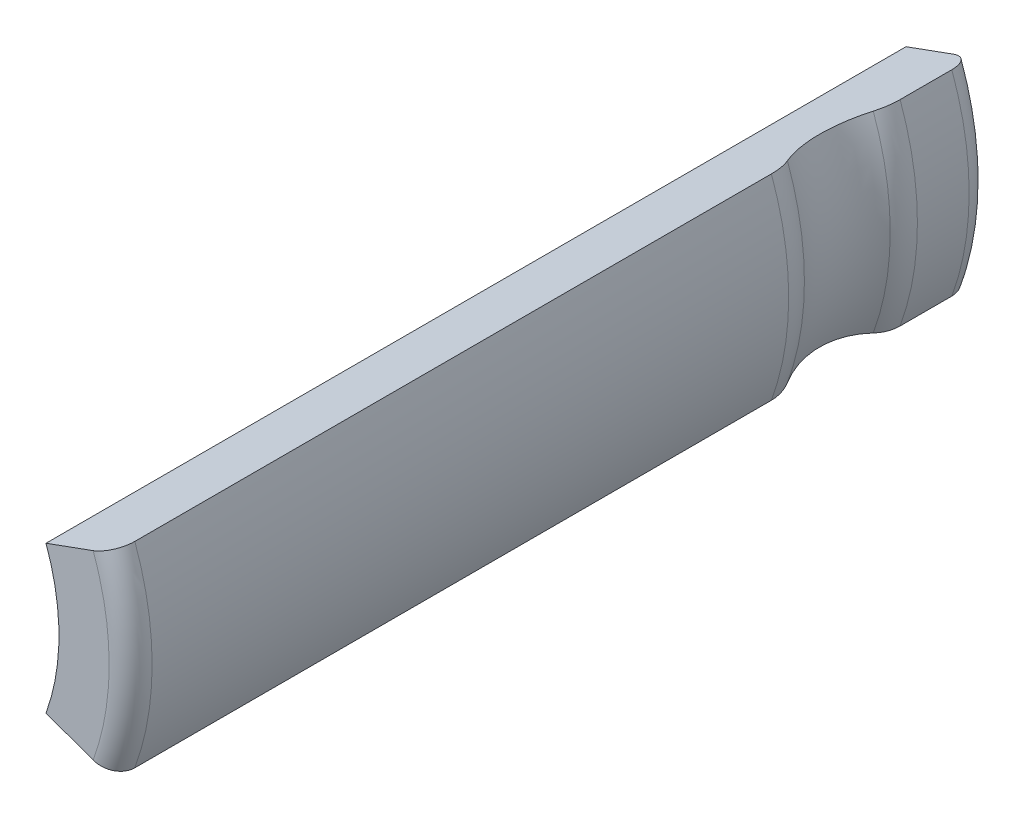
ISO-10303-21;
HEADER;
FILE_DESCRIPTION(('STEP AP214'),'2;1');
FILE_NAME('part.step','',(''),(''),'','','');
FILE_SCHEMA(('AUTOMOTIVE_DESIGN { 1 0 10303 214 1 1 1 1 }'));
ENDSEC;
DATA;
#1=APPLICATION_CONTEXT('core data for automotive mechanical design processes');
#2=APPLICATION_PROTOCOL_DEFINITION('international standard','automotive_design',2000,#1);
#3=PRODUCT_CONTEXT('',#1,'mechanical');
#4=PRODUCT('Part','Part','',(#3));
#5=PRODUCT_RELATED_PRODUCT_CATEGORY('part','',(#4));
#6=PRODUCT_DEFINITION_FORMATION('','',#4);
#7=PRODUCT_DEFINITION_CONTEXT('part definition',#1,'design');
#8=PRODUCT_DEFINITION('design','',#6,#7);
#9=PRODUCT_DEFINITION_SHAPE('','',#8);
#10=(LENGTH_UNIT() NAMED_UNIT(*) SI_UNIT(.MILLI.,.METRE.));
#11=(NAMED_UNIT(*) PLANE_ANGLE_UNIT() SI_UNIT($,.RADIAN.));
#12=(NAMED_UNIT(*) SI_UNIT($,.STERADIAN.) SOLID_ANGLE_UNIT());
#13=UNCERTAINTY_MEASURE_WITH_UNIT(LENGTH_MEASURE(1.E-05),#10,'distance_accuracy_value','');
#14=(GEOMETRIC_REPRESENTATION_CONTEXT(3) GLOBAL_UNCERTAINTY_ASSIGNED_CONTEXT((#13)) GLOBAL_UNIT_ASSIGNED_CONTEXT((#10,
#11,#12)) REPRESENTATION_CONTEXT('',''));
#15=CARTESIAN_POINT('',(0.,0.,0.));
#16=DIRECTION('',(0.,0.,1.));
#17=DIRECTION('',(1.,0.,0.));
#18=AXIS2_PLACEMENT_3D('',#15,#16,#17);
#19=CARTESIAN_POINT('',(-1.17063476967605E-11,0.,-21.93228260527));
#20=DIRECTION('',(0.,0.,1.));
#21=DIRECTION('',(1.,0.,0.));
#22=AXIS2_PLACEMENT_3D('',#19,#20,#21);
#23=TOROIDAL_SURFACE('',#22,3.39999999998313,0.600000000025918);
#24=CARTESIAN_POINT('',(3.19495491064553,-1.16286848729874,-21.93228260527));
#25=DIRECTION('',(-0.342020143324856,-0.939692620786204,0.));
#26=DIRECTION('',(0.939692620786204,-0.342020143324857,0.));
#27=AXIS2_PLACEMENT_3D('',#24,#25,#26);
#28=CIRCLE('',#27,0.600000000025918);
#29=CARTESIAN_POINT('',(3.68359507348009,-1.34071896183713,-21.6329500143242));
#30=VERTEX_POINT('',#29);
#31=CARTESIAN_POINT('',(3.75877048314319,-1.36808057330314,-21.93228260527));
#32=VERTEX_POINT('',#31);
#33=EDGE_CURVE('E114',#30,#32,#28,.F.);
#34=ORIENTED_EDGE('',*,*,#33,.T.);
#35=CARTESIAN_POINT('',(0.,0.,-21.93228260527));
#36=DIRECTION('',(0.,0.,1.));
#37=DIRECTION('',(1.,0.,0.));
#38=AXIS2_PLACEMENT_3D('',#35,#36,#37);
#39=CIRCLE('',#38,4.);
#40=CARTESIAN_POINT('',(3.7587704831432,1.36808057330319,-21.93228260527));
#41=VERTEX_POINT('',#40);
#42=EDGE_CURVE('E96',#41,#32,#39,.F.);
#43=ORIENTED_EDGE('',*,*,#42,.F.);
#44=CARTESIAN_POINT('',(3.19495491064316,1.16286848729795,-21.93228260527));
#45=DIRECTION('',(0.342020143324878,-0.939692620786196,0.));
#46=DIRECTION('',(0.939692620786196,0.342020143324878,0.));
#47=AXIS2_PLACEMENT_3D('',#44,#45,#46);
#48=CIRCLE('',#47,0.600000000028529);
#49=CARTESIAN_POINT('',(3.68359507348007,1.34071896183714,-21.6329500143237));
#50=VERTEX_POINT('',#49);
#51=EDGE_CURVE('E21',#41,#50,#48,.T.);
#52=ORIENTED_EDGE('',*,*,#51,.T.);
#53=CARTESIAN_POINT('',(-5.72068434290252E-12,0.,-21.63295001433));
#54=DIRECTION('',(0.,0.,-1.));
#55=DIRECTION('',(-1.,0.,0.));
#56=AXIS2_PLACEMENT_3D('',#53,#54,#55);
#57=CIRCLE('',#56,3.92000000000573);
#58=EDGE_CURVE('E103',#50,#30,#57,.T.);
#59=ORIENTED_EDGE('',*,*,#58,.T.);
#60=EDGE_LOOP('',(#34,#43,#52,#59));
#61=FACE_BOUND('',#60,.T.);
#62=ADVANCED_FACE('F17',(#61),#23,.T.);
#63=CARTESIAN_POINT('',(-1.49858424280946E-11,0.,-20.1362870596201));
#64=DIRECTION('',(0.,0.,1.));
#65=DIRECTION('',(1.,0.,0.));
#66=AXIS2_PLACEMENT_3D('',#63,#64,#65);
#67=TOROIDAL_SURFACE('',#66,3.4000000000407,0.599999999975521);
#68=CARTESIAN_POINT('',(-5.72068434290252E-12,0.,-20.43561965056));
#69=DIRECTION('',(0.,0.,1.));
#70=DIRECTION('',(1.,0.,0.));
#71=AXIS2_PLACEMENT_3D('',#68,#69,#70);
#72=CIRCLE('',#71,3.92000000000573);
#73=CARTESIAN_POINT('',(3.68359507348189,-1.34071896183787,-20.4356196505547));
#74=VERTEX_POINT('',#73);
#75=CARTESIAN_POINT('',(3.68359507348197,1.34071896183786,-20.4356196505552));
#76=VERTEX_POINT('',#75);
#77=EDGE_CURVE('E109',#74,#76,#72,.T.);
#78=ORIENTED_EDGE('',*,*,#77,.T.);
#79=CARTESIAN_POINT('',(3.19495491069669,1.16286848731751,-20.13628705962));
#80=DIRECTION('',(0.342020143324588,-0.939692620786302,0.));
#81=DIRECTION('',(0.939692620786302,0.342020143324588,0.));
#82=AXIS2_PLACEMENT_3D('',#79,#80,#81);
#83=CIRCLE('',#82,0.599999999975521);
#84=CARTESIAN_POINT('',(3.75877048314415,1.36808057330348,-20.13628705962));
#85=VERTEX_POINT('',#84);
#86=EDGE_CURVE('E118',#76,#85,#83,.T.);
#87=ORIENTED_EDGE('',*,*,#86,.T.);
#88=CARTESIAN_POINT('',(0.,0.,-20.13628705962));
#89=DIRECTION('',(0.,0.,1.));
#90=DIRECTION('',(1.,0.,0.));
#91=AXIS2_PLACEMENT_3D('',#88,#89,#90);
#92=CIRCLE('',#91,4.);
#93=CARTESIAN_POINT('',(3.75877048314406,-1.3680805733035,-20.13628705962));
#94=VERTEX_POINT('',#93);
#95=EDGE_CURVE('E140',#94,#85,#92,.T.);
#96=ORIENTED_EDGE('',*,*,#95,.F.);
#97=CARTESIAN_POINT('',(3.19495491069882,-1.16286848731839,-20.13628705962));
#98=DIRECTION('',(-0.342020143324615,-0.939692620786292,0.));
#99=DIRECTION('',(0.939692620786292,-0.342020143324615,0.));
#100=AXIS2_PLACEMENT_3D('',#97,#98,#99);
#101=CIRCLE('',#100,0.59999999997291);
#102=EDGE_CURVE('E142',#94,#74,#101,.F.);
#103=ORIENTED_EDGE('',*,*,#102,.T.);
#104=EDGE_LOOP('',(#78,#87,#96,#103));
#105=FACE_BOUND('',#104,.T.);
#106=ADVANCED_FACE('F196',(#105),#67,.T.);
#107=CARTESIAN_POINT('',(-9.63855731339613E-12,0.,-11.2542848324501));
#108=DIRECTION('',(0.,0.,1.));
#109=DIRECTION('',(1.,0.,0.));
#110=AXIS2_PLACEMENT_3D('',#107,#108,#109);
#111=TOROIDAL_SURFACE('',#110,3.70000000000964,0.300000000000002);
#112=CARTESIAN_POINT('',(0.,0.,-11.25428483245));
#113=DIRECTION('',(0.,0.,1.));
#114=DIRECTION('',(1.,0.,0.));
#115=AXIS2_PLACEMENT_3D('',#112,#113,#114);
#116=CIRCLE('',#115,4.);
#117=CARTESIAN_POINT('',(3.75877048314393,1.36808057330345,-11.25428483245));
#118=VERTEX_POINT('',#117);
#119=CARTESIAN_POINT('',(3.75877048314375,-1.36808057330323,-11.25428483245));
#120=VERTEX_POINT('',#119);
#121=EDGE_CURVE('E150',#118,#120,#116,.F.);
#122=ORIENTED_EDGE('',*,*,#121,.F.);
#123=CARTESIAN_POINT('',(3.47686269690812,1.26547453030595,-11.25428483245));
#124=DIRECTION('',(0.342020143325043,-0.939692620786136,0.));
#125=DIRECTION('',(0.939692620786136,0.342020143325043,0.));
#126=AXIS2_PLACEMENT_3D('',#123,#124,#125);
#127=CIRCLE('',#126,0.300000000000002);
#128=CARTESIAN_POINT('',(3.47686269690806,1.26547453030548,-10.95428483245));
#129=VERTEX_POINT('',#128);
#130=EDGE_CURVE('E134',#118,#129,#127,.T.);
#131=ORIENTED_EDGE('',*,*,#130,.T.);
#132=CARTESIAN_POINT('',(3.7,0.,-10.95428483245));
#133=CARTESIAN_POINT('',(3.7000939274515,0.652151765068626,-10.95428483245));
#134=CARTESIAN_POINT('',(3.476862696908,1.265474530305,-10.95428483245));
#135=B_SPLINE_CURVE_WITH_KNOTS('',2,(#132,#133,#134),.UNSPECIFIED.,.F.,.F.,(3,3),(0.,1.),.UNSPECIFIED.);
#136=CARTESIAN_POINT('',(3.7,0.,-10.95428483245));
#137=VERTEX_POINT('',#136);
#138=EDGE_CURVE('E169',#137,#129,#135,.T.);
#139=ORIENTED_EDGE('',*,*,#138,.F.);
#140=CARTESIAN_POINT('',(3.476862696908,-1.265474530305,-10.95428483245));
#141=CARTESIAN_POINT('',(3.69990599818284,-0.652668096489556,-10.95428483245));
#142=CARTESIAN_POINT('',(3.7,0.,-10.95428483245));
#143=B_SPLINE_CURVE_WITH_KNOTS('',2,(#140,#141,#142),.UNSPECIFIED.,.F.,.F.,(3,3),(0.,1.),.UNSPECIFIED.);
#144=CARTESIAN_POINT('',(3.4768626969079,-1.26547453030527,-10.95428483245));
#145=VERTEX_POINT('',#144);
#146=EDGE_CURVE('E124',#145,#137,#143,.T.);
#147=ORIENTED_EDGE('',*,*,#146,.F.);
#148=CARTESIAN_POINT('',(3.4768626969078,-1.26547453030553,-11.25428483245));
#149=DIRECTION('',(-0.34202014332497,-0.939692620786163,0.));
#150=DIRECTION('',(0.939692620786163,-0.34202014332497,0.));
#151=AXIS2_PLACEMENT_3D('',#148,#149,#150);
#152=CIRCLE('',#151,0.300000000000161);
#153=EDGE_CURVE('E138',#145,#120,#152,.F.);
#154=ORIENTED_EDGE('',*,*,#153,.T.);
#155=EDGE_LOOP('',(#122,#131,#139,#147,#154));
#156=FACE_BOUND('',#155,.T.);
#157=ADVANCED_FACE('F192',(#156),#111,.T.);
#158=CARTESIAN_POINT('',(0.,0.,-15.63428483245));
#159=DIRECTION('',(0.,0.,1.));
#160=DIRECTION('',(1.,0.,0.));
#161=AXIS2_PLACEMENT_3D('',#158,#159,#160);
#162=CYLINDRICAL_SURFACE('',#161,4.);
#163=ORIENTED_EDGE('',*,*,#121,.T.);
#164=DIRECTION('',(0.,0.,1.));
#165=VECTOR('',#164,1.);
#166=CARTESIAN_POINT('',(3.75877048314385,-1.36808057330342,-16.90959572905));
#167=LINE('',#166,#165);
#168=EDGE_CURVE('E162',#94,#120,#167,.T.);
#169=ORIENTED_EDGE('',*,*,#168,.F.);
#170=ORIENTED_EDGE('',*,*,#95,.T.);
#171=DIRECTION('',(0.,0.,1.));
#172=VECTOR('',#171,1.);
#173=CARTESIAN_POINT('',(3.75877048314385,1.36808057330342,-16.90959572905));
#174=LINE('',#173,#172);
#175=EDGE_CURVE('E120',#85,#118,#174,.T.);
#176=ORIENTED_EDGE('',*,*,#175,.T.);
#177=EDGE_LOOP('',(#163,#169,#170,#176));
#178=FACE_BOUND('',#177,.T.);
#179=ADVANCED_FACE('F189',(#178),#162,.T.);
#180=CARTESIAN_POINT('',(0.,0.,-22.35428483245));
#181=DIRECTION('',(0.,0.,1.));
#182=DIRECTION('',(1.,0.,0.));
#183=AXIS2_PLACEMENT_3D('',#180,#181,#182);
#184=CYLINDRICAL_SURFACE('',#183,4.);
#185=ORIENTED_EDGE('',*,*,#42,.T.);
#186=DIRECTION('',(0.,0.,1.));
#187=VECTOR('',#186,1.);
#188=CARTESIAN_POINT('',(3.75877048314385,-1.36808057330342,-16.90959572905));
#189=LINE('',#188,#187);
#190=CARTESIAN_POINT('',(3.75877048314386,-1.36808057330343,-22.65428483245));
#191=VERTEX_POINT('',#190);
#192=EDGE_CURVE('E149',#191,#32,#189,.T.);
#193=ORIENTED_EDGE('',*,*,#192,.F.);
#194=CARTESIAN_POINT('',(-1.49830235024462E-11,0.,-22.6542848324502));
#195=DIRECTION('',(0.,0.,-1.));
#196=DIRECTION('',(-1.,0.,0.));
#197=AXIS2_PLACEMENT_3D('',#194,#195,#196);
#198=CIRCLE('',#197,4.00000000001476);
#199=CARTESIAN_POINT('',(3.75877048314408,1.36808057330327,-22.65428483245));
#200=VERTEX_POINT('',#199);
#201=EDGE_CURVE('E137',#200,#191,#198,.T.);
#202=ORIENTED_EDGE('',*,*,#201,.F.);
#203=DIRECTION('',(0.,0.,1.));
#204=VECTOR('',#203,1.);
#205=CARTESIAN_POINT('',(3.75877048314385,1.36808057330342,-16.90959572905));
#206=LINE('',#205,#204);
#207=EDGE_CURVE('E121',#200,#41,#206,.T.);
#208=ORIENTED_EDGE('',*,*,#207,.T.);
#209=EDGE_LOOP('',(#185,#193,#202,#208));
#210=FACE_BOUND('',#209,.T.);
#211=ADVANCED_FACE('F148',(#210),#184,.T.);
#212=CARTESIAN_POINT('',(-5.72111802377151E-12,0.,-21.0342848324371));
#213=DIRECTION('',(0.,0.,1.));
#214=DIRECTION('',(1.,0.,0.));
#215=AXIS2_PLACEMENT_3D('',#212,#213,#214);
#216=TOROIDAL_SURFACE('',#215,4.96000000001256,1.2000000000065);
#217=ORIENTED_EDGE('',*,*,#77,.F.);
#218=CARTESIAN_POINT('',(4.66087539910477,-1.69641991089801,-21.0342848324371));
#219=DIRECTION('',(-0.342020143325346,-0.939692620786026,0.));
#220=DIRECTION('',(0.939692620786026,-0.342020143325346,0.));
#221=AXIS2_PLACEMENT_3D('',#218,#219,#220);
#222=CIRCLE('',#221,1.2000000000065);
#223=EDGE_CURVE('E108',#30,#74,#222,.F.);
#224=ORIENTED_EDGE('',*,*,#223,.F.);
#225=ORIENTED_EDGE('',*,*,#58,.F.);
#226=CARTESIAN_POINT('',(4.66087539910477,1.69641991089801,-21.0342848324371));
#227=DIRECTION('',(0.342020143325346,-0.939692620786026,0.));
#228=DIRECTION('',(0.939692620786026,0.342020143325346,0.));
#229=AXIS2_PLACEMENT_3D('',#226,#227,#228);
#230=CIRCLE('',#229,1.2000000000065);
#231=EDGE_CURVE('E106',#50,#76,#230,.F.);
#232=ORIENTED_EDGE('',*,*,#231,.T.);
#233=EDGE_LOOP('',(#217,#224,#225,#232));
#234=FACE_BOUND('',#233,.T.);
#235=ADVANCED_FACE('F104',(#234),#216,.F.);
#236=CARTESIAN_POINT('',(-1.49832403428807E-11,0.,-22.6542848324502));
#237=DIRECTION('',(0.,0.,1.));
#238=DIRECTION('',(1.,0.,0.));
#239=AXIS2_PLACEMENT_3D('',#236,#237,#238);
#240=TOROIDAL_SURFACE('',#239,3.70000000001422,0.300000000000159);
#241=CARTESIAN_POINT('',(3.47686269690766,-1.26547453030593,-22.65428483245));
#242=DIRECTION('',(-0.342020143324615,-0.939692620786292,0.));
#243=DIRECTION('',(0.939692620786292,-0.342020143324615,0.));
#244=AXIS2_PLACEMENT_3D('',#241,#242,#243);
#245=CIRCLE('',#244,0.300000000000159);
#246=CARTESIAN_POINT('',(3.47686269690783,-1.26547453030547,-22.95428483245));
#247=VERTEX_POINT('',#246);
#248=EDGE_CURVE('E130',#247,#191,#245,.T.);
#249=ORIENTED_EDGE('',*,*,#248,.F.);
#250=CARTESIAN_POINT('',(3.7,0.,-22.95428483245));
#251=CARTESIAN_POINT('',(3.7000939274515,-0.652151765068626,-22.95428483245));
#252=CARTESIAN_POINT('',(3.476862696908,-1.265474530305,-22.95428483245));
#253=B_SPLINE_CURVE_WITH_KNOTS('',2,(#250,#251,#252),.UNSPECIFIED.,.F.,.F.,(3,3),(0.,1.),.UNSPECIFIED.);
#254=CARTESIAN_POINT('',(3.7,0.,-22.95428483245));
#255=VERTEX_POINT('',#254);
#256=EDGE_CURVE('E219',#255,#247,#253,.T.);
#257=ORIENTED_EDGE('',*,*,#256,.F.);
#258=CARTESIAN_POINT('',(3.476862696908,1.265474530305,-22.95428483245));
#259=CARTESIAN_POINT('',(3.69990599818284,0.652668096489556,-22.95428483245));
#260=CARTESIAN_POINT('',(3.7,0.,-22.95428483245));
#261=B_SPLINE_CURVE_WITH_KNOTS('',2,(#258,#259,#260),.UNSPECIFIED.,.F.,.F.,(3,3),(0.,1.),.UNSPECIFIED.);
#262=CARTESIAN_POINT('',(3.47686269690826,1.2654745303054,-22.95428483245));
#263=VERTEX_POINT('',#262);
#264=EDGE_CURVE('E223',#263,#255,#261,.T.);
#265=ORIENTED_EDGE('',*,*,#264,.F.);
#266=CARTESIAN_POINT('',(3.47686269690852,1.2654745303058,-22.65428483245));
#267=DIRECTION('',(0.342020143324508,-0.939692620786331,0.));
#268=DIRECTION('',(0.939692620786331,0.342020143324508,0.));
#269=AXIS2_PLACEMENT_3D('',#266,#267,#268);
#270=CIRCLE('',#269,0.300000000000001);
#271=EDGE_CURVE('E126',#263,#200,#270,.T.);
#272=ORIENTED_EDGE('',*,*,#271,.T.);
#273=ORIENTED_EDGE('',*,*,#201,.T.);
#274=EDGE_LOOP('',(#249,#257,#265,#272,#273));
#275=FACE_BOUND('',#274,.T.);
#276=ADVANCED_FACE('F19',(#275),#240,.T.);
#277=CARTESIAN_POINT('',(3.27705377409,1.192750029859,-16.90959572905));
#278=DIRECTION('',(0.342020143325932,-0.939692620785813,0.));
#279=DIRECTION('',(0.939692620785813,0.342020143325932,0.));
#280=AXIS2_PLACEMENT_3D('',#277,#278,#279);
#281=PLANE('',#280);
#282=ORIENTED_EDGE('',*,*,#86,.F.);
#283=ORIENTED_EDGE('',*,*,#231,.F.);
#284=ORIENTED_EDGE('',*,*,#51,.F.);
#285=ORIENTED_EDGE('',*,*,#207,.F.);
#286=ORIENTED_EDGE('',*,*,#271,.F.);
#287=DIRECTION('',(0.939692620785871,0.342020143325771,0.));
#288=VECTOR('',#287,1.);
#289=CARTESIAN_POINT('',(2.819077862358,1.026060429977,-22.95428483245));
#290=LINE('',#289,#288);
#291=CARTESIAN_POINT('',(2.81907786235776,1.02606042997691,-22.95428483245));
#292=VERTEX_POINT('',#291);
#293=EDGE_CURVE('E156',#292,#263,#290,.T.);
#294=ORIENTED_EDGE('',*,*,#293,.F.);
#295=DIRECTION('',(0.,0.,1.));
#296=VECTOR('',#295,1.);
#297=CARTESIAN_POINT('',(2.81907786235776,1.02606042997691,-16.95428483245));
#298=LINE('',#297,#296);
#299=CARTESIAN_POINT('',(2.81907786235776,1.02606042997691,-10.95428483245));
#300=VERTEX_POINT('',#299);
#301=EDGE_CURVE('E234',#292,#300,#298,.T.);
#302=ORIENTED_EDGE('',*,*,#301,.T.);
#303=DIRECTION('',(-0.939692620785871,-0.342020143325772,0.));
#304=VECTOR('',#303,1.);
#305=CARTESIAN_POINT('',(3.476862696908,1.265474530305,-10.95428483245));
#306=LINE('',#305,#304);
#307=EDGE_CURVE('E165',#129,#300,#306,.T.);
#308=ORIENTED_EDGE('',*,*,#307,.F.);
#309=ORIENTED_EDGE('',*,*,#130,.F.);
#310=ORIENTED_EDGE('',*,*,#175,.F.);
#311=EDGE_LOOP('',(#282,#283,#284,#285,#286,#294,#302,#308,#309,#310));
#312=FACE_BOUND('',#311,.T.);
#313=ADVANCED_FACE('F115',(#312),#281,.F.);
#314=CARTESIAN_POINT('',(2.819077862358,-1.026060429977,-10.95428483245));
#315=DIRECTION('',(0.,0.,1.));
#316=DIRECTION('',(1.,0.,0.));
#317=AXIS2_PLACEMENT_3D('',#314,#315,#316);
#318=PLANE('',#317);
#319=ORIENTED_EDGE('',*,*,#138,.T.);
#320=ORIENTED_EDGE('',*,*,#307,.T.);
#321=CARTESIAN_POINT('',(0.,0.,-10.95428483245));
#322=DIRECTION('',(0.,0.,1.));
#323=DIRECTION('',(1.,0.,0.));
#324=AXIS2_PLACEMENT_3D('',#321,#322,#323);
#325=CIRCLE('',#324,3.);
#326=CARTESIAN_POINT('',(2.81907786235768,-1.02606042997713,-10.95428483245));
#327=VERTEX_POINT('',#326);
#328=EDGE_CURVE('E236',#300,#327,#325,.F.);
#329=ORIENTED_EDGE('',*,*,#328,.T.);
#330=DIRECTION('',(0.939692620785813,-0.342020143325932,0.));
#331=VECTOR('',#330,1.);
#332=CARTESIAN_POINT('',(3.27705377409,-1.192750029859,-10.95428483245));
#333=LINE('',#332,#331);
#334=EDGE_CURVE('E157',#145,#327,#333,.F.);
#335=ORIENTED_EDGE('',*,*,#334,.F.);
#336=ORIENTED_EDGE('',*,*,#146,.T.);
#337=EDGE_LOOP('',(#319,#320,#329,#335,#336));
#338=FACE_BOUND('',#337,.T.);
#339=ADVANCED_FACE('F172',(#338),#318,.T.);
#340=CARTESIAN_POINT('',(3.27705377409,-1.192750029859,-16.90959572905));
#341=DIRECTION('',(-0.342020143325932,-0.939692620785813,0.));
#342=DIRECTION('',(0.939692620785813,-0.342020143325932,0.));
#343=AXIS2_PLACEMENT_3D('',#340,#341,#342);
#344=PLANE('',#343);
#345=ORIENTED_EDGE('',*,*,#33,.F.);
#346=ORIENTED_EDGE('',*,*,#223,.T.);
#347=ORIENTED_EDGE('',*,*,#102,.F.);
#348=ORIENTED_EDGE('',*,*,#168,.T.);
#349=ORIENTED_EDGE('',*,*,#153,.F.);
#350=ORIENTED_EDGE('',*,*,#334,.T.);
#351=DIRECTION('',(0.,0.,1.));
#352=VECTOR('',#351,1.);
#353=CARTESIAN_POINT('',(2.81907786235776,-1.02606042997691,-16.95428483245));
#354=LINE('',#353,#352);
#355=CARTESIAN_POINT('',(2.81907786235776,-1.02606042997691,-22.95428483245));
#356=VERTEX_POINT('',#355);
#357=EDGE_CURVE('E27',#327,#356,#354,.F.);
#358=ORIENTED_EDGE('',*,*,#357,.T.);
#359=DIRECTION('',(-0.939692620785871,0.342020143325771,0.));
#360=VECTOR('',#359,1.);
#361=CARTESIAN_POINT('',(3.476862696908,-1.265474530305,-22.95428483245));
#362=LINE('',#361,#360);
#363=EDGE_CURVE('E35',#247,#356,#362,.T.);
#364=ORIENTED_EDGE('',*,*,#363,.F.);
#365=ORIENTED_EDGE('',*,*,#248,.T.);
#366=ORIENTED_EDGE('',*,*,#192,.T.);
#367=EDGE_LOOP('',(#345,#346,#347,#348,#349,#350,#358,#364,#365,#366));
#368=FACE_BOUND('',#367,.T.);
#369=ADVANCED_FACE('F153',(#368),#344,.T.);
#370=CARTESIAN_POINT('',(3.758770483144,-1.368080573303,-22.95428483245));
#371=DIRECTION('',(0.,0.,-1.));
#372=DIRECTION('',(-1.,0.,0.));
#373=AXIS2_PLACEMENT_3D('',#370,#371,#372);
#374=PLANE('',#373);
#375=ORIENTED_EDGE('',*,*,#256,.T.);
#376=ORIENTED_EDGE('',*,*,#363,.T.);
#377=CARTESIAN_POINT('',(0.,0.,-22.95428483245));
#378=DIRECTION('',(0.,0.,1.));
#379=DIRECTION('',(1.,0.,0.));
#380=AXIS2_PLACEMENT_3D('',#377,#378,#379);
#381=CIRCLE('',#380,3.);
#382=EDGE_CURVE('E11',#356,#292,#381,.T.);
#383=ORIENTED_EDGE('',*,*,#382,.T.);
#384=ORIENTED_EDGE('',*,*,#293,.T.);
#385=ORIENTED_EDGE('',*,*,#264,.T.);
#386=EDGE_LOOP('',(#375,#376,#383,#384,#385));
#387=FACE_BOUND('',#386,.T.);
#388=ADVANCED_FACE('F210',(#387),#374,.T.);
#389=CARTESIAN_POINT('',(0.,0.,-16.95428483245));
#390=DIRECTION('',(0.,0.,1.));
#391=DIRECTION('',(1.,0.,0.));
#392=AXIS2_PLACEMENT_3D('',#389,#390,#391);
#393=CYLINDRICAL_SURFACE('',#392,3.);
#394=ORIENTED_EDGE('',*,*,#382,.F.);
#395=ORIENTED_EDGE('',*,*,#357,.F.);
#396=ORIENTED_EDGE('',*,*,#328,.F.);
#397=ORIENTED_EDGE('',*,*,#301,.F.);
#398=EDGE_LOOP('',(#394,#395,#396,#397));
#399=FACE_BOUND('',#398,.T.);
#400=ADVANCED_FACE('F208',(#399),#393,.F.);
#401=CLOSED_SHELL('',(#62,#106,#157,#179,#211,#235,#276,#313,#339,#369,#388,#400));
#402=MANIFOLD_SOLID_BREP('B1',#401);
#403=ADVANCED_BREP_SHAPE_REPRESENTATION('',(#18,#402),#14);
#404=SHAPE_DEFINITION_REPRESENTATION(#9,#403);
ENDSEC;
END-ISO-10303-21;
